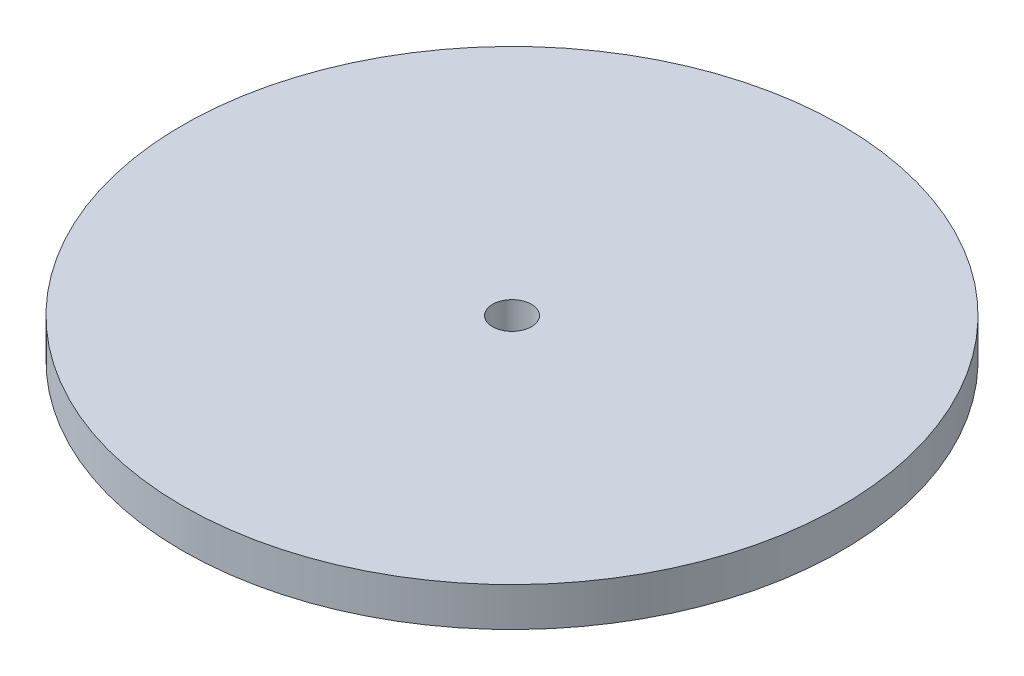
ISO-10303-21;
HEADER;
FILE_DESCRIPTION(('STEP AP214'),'2;1');
FILE_NAME('part.step','',(''),(''),'','','');
FILE_SCHEMA(('AUTOMOTIVE_DESIGN { 1 0 10303 214 1 1 1 1 }'));
ENDSEC;
DATA;
#1=APPLICATION_CONTEXT('core data for automotive mechanical design processes');
#2=APPLICATION_PROTOCOL_DEFINITION('international standard','automotive_design',2000,#1);
#3=PRODUCT_CONTEXT('',#1,'mechanical');
#4=PRODUCT('Part','Part','',(#3));
#5=PRODUCT_RELATED_PRODUCT_CATEGORY('part','',(#4));
#6=PRODUCT_DEFINITION_FORMATION('','',#4);
#7=PRODUCT_DEFINITION_CONTEXT('part definition',#1,'design');
#8=PRODUCT_DEFINITION('design','',#6,#7);
#9=PRODUCT_DEFINITION_SHAPE('','',#8);
#10=(LENGTH_UNIT() NAMED_UNIT(*) SI_UNIT(.MILLI.,.METRE.));
#11=(NAMED_UNIT(*) PLANE_ANGLE_UNIT() SI_UNIT($,.RADIAN.));
#12=(NAMED_UNIT(*) SI_UNIT($,.STERADIAN.) SOLID_ANGLE_UNIT());
#13=UNCERTAINTY_MEASURE_WITH_UNIT(LENGTH_MEASURE(1.E-05),#10,'distance_accuracy_value','');
#14=(GEOMETRIC_REPRESENTATION_CONTEXT(3) GLOBAL_UNCERTAINTY_ASSIGNED_CONTEXT((#13)) GLOBAL_UNIT_ASSIGNED_CONTEXT((#10,
#11,#12)) REPRESENTATION_CONTEXT('',''));
#15=CARTESIAN_POINT('',(0.,0.,0.));
#16=DIRECTION('',(0.,0.,1.));
#17=DIRECTION('',(1.,0.,0.));
#18=AXIS2_PLACEMENT_3D('',#15,#16,#17);
#19=CARTESIAN_POINT('',(0.,12.7,0.));
#20=DIRECTION('',(0.,1.,0.));
#21=DIRECTION('',(0.,0.,1.));
#22=AXIS2_PLACEMENT_3D('',#19,#20,#21);
#23=PLANE('',#22);
#24=CARTESIAN_POINT('',(0.,12.7,0.));
#25=DIRECTION('',(0.,1.,0.));
#26=DIRECTION('',(0.,0.,1.));
#27=AXIS2_PLACEMENT_3D('',#24,#25,#26);
#28=CIRCLE('',#27,107.5);
#29=CARTESIAN_POINT('',(0.,12.7,107.5));
#30=VERTEX_POINT('',#29);
#31=EDGE_CURVE('E10',#30,#30,#28,.T.);
#32=ORIENTED_EDGE('',*,*,#31,.T.);
#33=EDGE_LOOP('',(#32));
#34=FACE_BOUND('',#33,.T.);
#35=CARTESIAN_POINT('',(0.,12.7,0.));
#36=DIRECTION('',(0.,1.,0.));
#37=DIRECTION('',(0.,0.,1.));
#38=AXIS2_PLACEMENT_3D('',#35,#36,#37);
#39=CIRCLE('',#38,6.35);
#40=CARTESIAN_POINT('',(0.,12.7,6.35));
#41=VERTEX_POINT('',#40);
#42=EDGE_CURVE('E43',#41,#41,#39,.T.);
#43=ORIENTED_EDGE('',*,*,#42,.F.);
#44=EDGE_LOOP('',(#43));
#45=FACE_BOUND('',#44,.T.);
#46=ADVANCED_FACE('F32',(#34,#45),#23,.T.);
#47=CARTESIAN_POINT('',(0.,0.,0.));
#48=DIRECTION('',(0.,1.,0.));
#49=DIRECTION('',(0.,0.,1.));
#50=AXIS2_PLACEMENT_3D('',#47,#48,#49);
#51=PLANE('',#50);
#52=CARTESIAN_POINT('',(0.,0.,0.));
#53=DIRECTION('',(0.,1.,0.));
#54=DIRECTION('',(0.,0.,1.));
#55=AXIS2_PLACEMENT_3D('',#52,#53,#54);
#56=CIRCLE('',#55,107.5);
#57=CARTESIAN_POINT('',(0.,0.,107.5));
#58=VERTEX_POINT('',#57);
#59=EDGE_CURVE('E36',#58,#58,#56,.T.);
#60=ORIENTED_EDGE('',*,*,#59,.F.);
#61=EDGE_LOOP('',(#60));
#62=FACE_BOUND('',#61,.T.);
#63=CARTESIAN_POINT('',(0.,0.,0.));
#64=DIRECTION('',(0.,1.,0.));
#65=DIRECTION('',(0.,0.,1.));
#66=AXIS2_PLACEMENT_3D('',#63,#64,#65);
#67=CIRCLE('',#66,6.35);
#68=CARTESIAN_POINT('',(0.,0.,6.35));
#69=VERTEX_POINT('',#68);
#70=EDGE_CURVE('E45',#69,#69,#67,.T.);
#71=ORIENTED_EDGE('',*,*,#70,.T.);
#72=EDGE_LOOP('',(#71));
#73=FACE_BOUND('',#72,.T.);
#74=ADVANCED_FACE('F55',(#62,#73),#51,.F.);
#75=CARTESIAN_POINT('',(0.,12.7,0.));
#76=DIRECTION('',(0.,-1.,0.));
#77=DIRECTION('',(0.,0.,-1.));
#78=AXIS2_PLACEMENT_3D('',#75,#76,#77);
#79=CYLINDRICAL_SURFACE('',#78,107.5);
#80=ORIENTED_EDGE('',*,*,#31,.F.);
#81=EDGE_LOOP('',(#80));
#82=FACE_BOUND('',#81,.T.);
#83=ORIENTED_EDGE('',*,*,#59,.T.);
#84=EDGE_LOOP('',(#83));
#85=FACE_BOUND('',#84,.T.);
#86=ADVANCED_FACE('F34',(#82,#85),#79,.T.);
#87=CARTESIAN_POINT('',(0.,12.7,0.));
#88=DIRECTION('',(0.,-1.,0.));
#89=DIRECTION('',(0.,0.,-1.));
#90=AXIS2_PLACEMENT_3D('',#87,#88,#89);
#91=CYLINDRICAL_SURFACE('',#90,6.35);
#92=ORIENTED_EDGE('',*,*,#42,.T.);
#93=EDGE_LOOP('',(#92));
#94=FACE_BOUND('',#93,.T.);
#95=ORIENTED_EDGE('',*,*,#70,.F.);
#96=EDGE_LOOP('',(#95));
#97=FACE_BOUND('',#96,.T.);
#98=ADVANCED_FACE('F51',(#94,#97),#91,.F.);
#99=CLOSED_SHELL('',(#46,#74,#86,#98));
#100=MANIFOLD_SOLID_BREP('B2',#99);
#101=ADVANCED_BREP_SHAPE_REPRESENTATION('',(#18,#100),#14);
#102=SHAPE_DEFINITION_REPRESENTATION(#9,#101);
ENDSEC;
END-ISO-10303-21;
